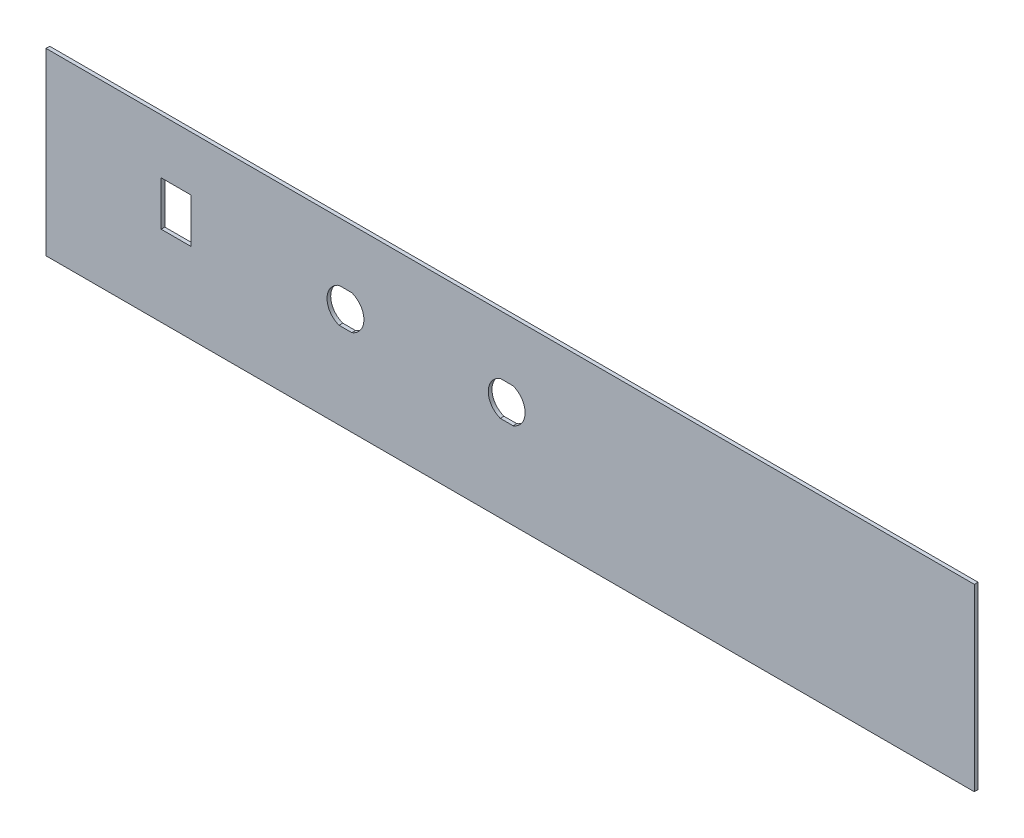
ISO-10303-21;
HEADER;
FILE_DESCRIPTION(('STEP AP214'),'2;1');
FILE_NAME('part.step','',(''),(''),'','','');
FILE_SCHEMA(('AUTOMOTIVE_DESIGN { 1 0 10303 214 1 1 1 1 }'));
ENDSEC;
DATA;
#1=APPLICATION_CONTEXT('core data for automotive mechanical design processes');
#2=APPLICATION_PROTOCOL_DEFINITION('international standard','automotive_design',2000,#1);
#3=PRODUCT_CONTEXT('',#1,'mechanical');
#4=PRODUCT('Part','Part','',(#3));
#5=PRODUCT_RELATED_PRODUCT_CATEGORY('part','',(#4));
#6=PRODUCT_DEFINITION_FORMATION('','',#4);
#7=PRODUCT_DEFINITION_CONTEXT('part definition',#1,'design');
#8=PRODUCT_DEFINITION('design','',#6,#7);
#9=PRODUCT_DEFINITION_SHAPE('','',#8);
#10=(LENGTH_UNIT() NAMED_UNIT(*) SI_UNIT(.MILLI.,.METRE.));
#11=(NAMED_UNIT(*) PLANE_ANGLE_UNIT() SI_UNIT($,.RADIAN.));
#12=(NAMED_UNIT(*) SI_UNIT($,.STERADIAN.) SOLID_ANGLE_UNIT());
#13=UNCERTAINTY_MEASURE_WITH_UNIT(LENGTH_MEASURE(1.E-05),#10,'distance_accuracy_value','');
#14=(GEOMETRIC_REPRESENTATION_CONTEXT(3) GLOBAL_UNCERTAINTY_ASSIGNED_CONTEXT((#13)) GLOBAL_UNIT_ASSIGNED_CONTEXT((#10,
#11,#12)) REPRESENTATION_CONTEXT('',''));
#15=CARTESIAN_POINT('',(0.,0.,0.));
#16=DIRECTION('',(0.,0.,1.));
#17=DIRECTION('',(1.,0.,0.));
#18=AXIS2_PLACEMENT_3D('',#15,#16,#17);
#19=CARTESIAN_POINT('',(0.,0.,1.6));
#20=DIRECTION('',(0.,0.,-1.));
#21=DIRECTION('',(-1.,0.,0.));
#22=AXIS2_PLACEMENT_3D('',#19,#20,#21);
#23=PLANE('',#22);
#24=DIRECTION('',(1.,0.,0.));
#25=VECTOR('',#24,1.);
#26=CARTESIAN_POINT('',(132.783736537781,37.4999459409795,1.6));
#27=LINE('',#26,#25);
#28=CARTESIAN_POINT('',(127.216263462219,37.4999459409795,1.6));
#29=VERTEX_POINT('',#28);
#30=CARTESIAN_POINT('',(132.783736537781,37.4999459409796,1.6));
#31=VERTEX_POINT('',#30);
#32=EDGE_CURVE('E157',#29,#31,#27,.T.);
#33=ORIENTED_EDGE('',*,*,#32,.F.);
#34=CARTESIAN_POINT('',(130.,45.,1.6));
#35=DIRECTION('',(0.,0.,1.));
#36=DIRECTION('',(1.,0.,0.));
#37=AXIS2_PLACEMENT_3D('',#34,#35,#36);
#38=CIRCLE('',#37,8.00000000000019);
#39=CARTESIAN_POINT('',(127.216263462219,52.5000540590203,1.6));
#40=VERTEX_POINT('',#39);
#41=EDGE_CURVE('E48',#40,#29,#38,.T.);
#42=ORIENTED_EDGE('',*,*,#41,.F.);
#43=DIRECTION('',(-1.,0.,0.));
#44=VECTOR('',#43,1.);
#45=CARTESIAN_POINT('',(127.216263462219,52.5000540590203,1.6));
#46=LINE('',#45,#44);
#47=CARTESIAN_POINT('',(132.783736537781,52.5000540590203,1.6));
#48=VERTEX_POINT('',#47);
#49=EDGE_CURVE('E163',#48,#40,#46,.T.);
#50=ORIENTED_EDGE('',*,*,#49,.F.);
#51=CARTESIAN_POINT('',(130.,45.,1.6));
#52=DIRECTION('',(0.,0.,1.));
#53=DIRECTION('',(1.,0.,0.));
#54=AXIS2_PLACEMENT_3D('',#51,#52,#53);
#55=CIRCLE('',#54,8.0000000000004);
#56=EDGE_CURVE('E148',#31,#48,#55,.T.);
#57=ORIENTED_EDGE('',*,*,#56,.F.);
#58=EDGE_LOOP('',(#33,#42,#50,#57));
#59=FACE_BOUND('',#58,.T.);
#60=DIRECTION('',(0.,-1.,0.));
#61=VECTOR('',#60,1.);
#62=CARTESIAN_POINT('',(0.,0.,1.6));
#63=LINE('',#62,#61);
#64=CARTESIAN_POINT('',(0.,78.,1.6));
#65=VERTEX_POINT('',#64);
#66=CARTESIAN_POINT('',(0.,0.,1.6));
#67=VERTEX_POINT('',#66);
#68=EDGE_CURVE('E223',#65,#67,#63,.T.);
#69=ORIENTED_EDGE('',*,*,#68,.T.);
#70=DIRECTION('',(1.,0.,0.));
#71=VECTOR('',#70,1.);
#72=CARTESIAN_POINT('',(0.,0.,1.6));
#73=LINE('',#72,#71);
#74=CARTESIAN_POINT('',(403.,0.,1.6));
#75=VERTEX_POINT('',#74);
#76=EDGE_CURVE('E226',#67,#75,#73,.T.);
#77=ORIENTED_EDGE('',*,*,#76,.T.);
#78=DIRECTION('',(0.,1.,0.));
#79=VECTOR('',#78,1.);
#80=CARTESIAN_POINT('',(403.,0.,1.6));
#81=LINE('',#80,#79);
#82=CARTESIAN_POINT('',(403.,78.,1.6));
#83=VERTEX_POINT('',#82);
#84=EDGE_CURVE('E229',#75,#83,#81,.T.);
#85=ORIENTED_EDGE('',*,*,#84,.T.);
#86=DIRECTION('',(-1.,0.,0.));
#87=VECTOR('',#86,1.);
#88=CARTESIAN_POINT('',(0.,78.,1.6));
#89=LINE('',#88,#87);
#90=EDGE_CURVE('E231',#83,#65,#89,.T.);
#91=ORIENTED_EDGE('',*,*,#90,.T.);
#92=EDGE_LOOP('',(#69,#77,#85,#91));
#93=FACE_BOUND('',#92,.T.);
#94=DIRECTION('',(1.,0.,0.));
#95=VECTOR('',#94,1.);
#96=CARTESIAN_POINT('',(50.,35.,1.6));
#97=LINE('',#96,#95);
#98=CARTESIAN_POINT('',(50.,35.,1.6));
#99=VERTEX_POINT('',#98);
#100=CARTESIAN_POINT('',(62.9,35.,1.6));
#101=VERTEX_POINT('',#100);
#102=EDGE_CURVE('E204',#99,#101,#97,.T.);
#103=ORIENTED_EDGE('',*,*,#102,.F.);
#104=DIRECTION('',(0.,-1.,0.));
#105=VECTOR('',#104,1.);
#106=CARTESIAN_POINT('',(50.,54.33,1.6));
#107=LINE('',#106,#105);
#108=CARTESIAN_POINT('',(50.,54.33,1.6));
#109=VERTEX_POINT('',#108);
#110=EDGE_CURVE('E202',#109,#99,#107,.T.);
#111=ORIENTED_EDGE('',*,*,#110,.F.);
#112=DIRECTION('',(-1.,0.,0.));
#113=VECTOR('',#112,1.);
#114=CARTESIAN_POINT('',(50.,54.33,1.6));
#115=LINE('',#114,#113);
#116=CARTESIAN_POINT('',(62.9,54.33,1.6));
#117=VERTEX_POINT('',#116);
#118=EDGE_CURVE('E210',#117,#109,#115,.T.);
#119=ORIENTED_EDGE('',*,*,#118,.F.);
#120=DIRECTION('',(0.,1.,0.));
#121=VECTOR('',#120,1.);
#122=CARTESIAN_POINT('',(62.9,54.33,1.6));
#123=LINE('',#122,#121);
#124=EDGE_CURVE('E207',#101,#117,#123,.T.);
#125=ORIENTED_EDGE('',*,*,#124,.F.);
#126=EDGE_LOOP('',(#103,#111,#119,#125));
#127=FACE_BOUND('',#126,.T.);
#128=CARTESIAN_POINT('',(200.,45.,1.6));
#129=DIRECTION('',(0.,0.,-1.));
#130=DIRECTION('',(-1.,0.,0.));
#131=AXIS2_PLACEMENT_3D('',#128,#129,#130);
#132=CIRCLE('',#131,8.00000000000008);
#133=CARTESIAN_POINT('',(197.21626346222,52.5000540590204,1.6));
#134=VERTEX_POINT('',#133);
#135=CARTESIAN_POINT('',(197.21626346222,37.4999459409796,1.6));
#136=VERTEX_POINT('',#135);
#137=EDGE_CURVE('E200',#134,#136,#132,.F.);
#138=ORIENTED_EDGE('',*,*,#137,.F.);
#139=DIRECTION('',(-1.,0.,0.));
#140=VECTOR('',#139,1.);
#141=CARTESIAN_POINT('',(0.,52.5000540590204,1.6));
#142=LINE('',#141,#140);
#143=CARTESIAN_POINT('',(202.78373653778,52.5000540590204,1.6));
#144=VERTEX_POINT('',#143);
#145=EDGE_CURVE('E193',#144,#134,#142,.T.);
#146=ORIENTED_EDGE('',*,*,#145,.F.);
#147=CARTESIAN_POINT('',(200.,45.,1.6));
#148=DIRECTION('',(0.,0.,-1.));
#149=DIRECTION('',(-1.,0.,0.));
#150=AXIS2_PLACEMENT_3D('',#147,#148,#149);
#151=CIRCLE('',#150,8.00000000000009);
#152=CARTESIAN_POINT('',(202.78373653778,37.4999459409796,1.6));
#153=VERTEX_POINT('',#152);
#154=EDGE_CURVE('E195',#153,#144,#151,.F.);
#155=ORIENTED_EDGE('',*,*,#154,.F.);
#156=DIRECTION('',(1.,0.,0.));
#157=VECTOR('',#156,1.);
#158=CARTESIAN_POINT('',(0.,37.4999459409796,1.6));
#159=LINE('',#158,#157);
#160=EDGE_CURVE('E198',#136,#153,#159,.T.);
#161=ORIENTED_EDGE('',*,*,#160,.F.);
#162=EDGE_LOOP('',(#138,#146,#155,#161));
#163=FACE_BOUND('',#162,.T.);
#164=ADVANCED_FACE('F33',(#59,#93,#127,#163),#23,.F.);
#165=CARTESIAN_POINT('',(0.,0.,0.));
#166=DIRECTION('',(0.,0.,-1.));
#167=DIRECTION('',(-1.,0.,0.));
#168=AXIS2_PLACEMENT_3D('',#165,#166,#167);
#169=PLANE('',#168);
#170=CARTESIAN_POINT('',(130.,45.,0.));
#171=DIRECTION('',(0.,0.,-1.));
#172=DIRECTION('',(-1.,0.,0.));
#173=AXIS2_PLACEMENT_3D('',#170,#171,#172);
#174=CIRCLE('',#173,8.00000000000019);
#175=CARTESIAN_POINT('',(127.216263462219,37.4999459409795,0.));
#176=VERTEX_POINT('',#175);
#177=CARTESIAN_POINT('',(127.216263462219,52.5000540590203,0.));
#178=VERTEX_POINT('',#177);
#179=EDGE_CURVE('E11',#176,#178,#174,.T.);
#180=ORIENTED_EDGE('',*,*,#179,.F.);
#181=DIRECTION('',(-1.,0.,0.));
#182=VECTOR('',#181,1.);
#183=CARTESIAN_POINT('',(0.,37.4999459409793,0.));
#184=LINE('',#183,#182);
#185=CARTESIAN_POINT('',(132.783736537781,37.4999459409795,0.));
#186=VERTEX_POINT('',#185);
#187=EDGE_CURVE('E261',#186,#176,#184,.T.);
#188=ORIENTED_EDGE('',*,*,#187,.F.);
#189=CARTESIAN_POINT('',(130.,45.,0.));
#190=DIRECTION('',(0.,0.,-1.));
#191=DIRECTION('',(-1.,0.,0.));
#192=AXIS2_PLACEMENT_3D('',#189,#190,#191);
#193=CIRCLE('',#192,8.0000000000004);
#194=CARTESIAN_POINT('',(132.783736537781,52.5000540590203,0.));
#195=VERTEX_POINT('',#194);
#196=EDGE_CURVE('E151',#195,#186,#193,.T.);
#197=ORIENTED_EDGE('',*,*,#196,.F.);
#198=DIRECTION('',(1.,0.,0.));
#199=VECTOR('',#198,1.);
#200=CARTESIAN_POINT('',(0.,52.5000540590204,0.));
#201=LINE('',#200,#199);
#202=EDGE_CURVE('E41',#178,#195,#201,.T.);
#203=ORIENTED_EDGE('',*,*,#202,.F.);
#204=EDGE_LOOP('',(#180,#188,#197,#203));
#205=FACE_BOUND('',#204,.T.);
#206=DIRECTION('',(0.,1.,0.));
#207=VECTOR('',#206,1.);
#208=CARTESIAN_POINT('',(50.,0.,0.));
#209=LINE('',#208,#207);
#210=CARTESIAN_POINT('',(50.,35.,0.));
#211=VERTEX_POINT('',#210);
#212=CARTESIAN_POINT('',(50.,54.33,0.));
#213=VERTEX_POINT('',#212);
#214=EDGE_CURVE('E259',#211,#213,#209,.T.);
#215=ORIENTED_EDGE('',*,*,#214,.F.);
#216=DIRECTION('',(-1.,0.,0.));
#217=VECTOR('',#216,1.);
#218=CARTESIAN_POINT('',(0.,35.,0.));
#219=LINE('',#218,#217);
#220=CARTESIAN_POINT('',(62.9,35.,0.));
#221=VERTEX_POINT('',#220);
#222=EDGE_CURVE('E252',#221,#211,#219,.T.);
#223=ORIENTED_EDGE('',*,*,#222,.F.);
#224=DIRECTION('',(0.,-1.,0.));
#225=VECTOR('',#224,1.);
#226=CARTESIAN_POINT('',(62.9,0.,0.));
#227=LINE('',#226,#225);
#228=CARTESIAN_POINT('',(62.9,54.33,0.));
#229=VERTEX_POINT('',#228);
#230=EDGE_CURVE('E254',#229,#221,#227,.T.);
#231=ORIENTED_EDGE('',*,*,#230,.F.);
#232=DIRECTION('',(1.,0.,0.));
#233=VECTOR('',#232,1.);
#234=CARTESIAN_POINT('',(0.,54.33,0.));
#235=LINE('',#234,#233);
#236=EDGE_CURVE('E257',#213,#229,#235,.T.);
#237=ORIENTED_EDGE('',*,*,#236,.F.);
#238=EDGE_LOOP('',(#215,#223,#231,#237));
#239=FACE_BOUND('',#238,.T.);
#240=DIRECTION('',(0.,-1.,0.));
#241=VECTOR('',#240,1.);
#242=CARTESIAN_POINT('',(0.,0.,0.));
#243=LINE('',#242,#241);
#244=CARTESIAN_POINT('',(0.,78.,0.));
#245=VERTEX_POINT('',#244);
#246=CARTESIAN_POINT('',(0.,0.,0.));
#247=VERTEX_POINT('',#246);
#248=EDGE_CURVE('E216',#245,#247,#243,.T.);
#249=ORIENTED_EDGE('',*,*,#248,.F.);
#250=DIRECTION('',(-1.,0.,0.));
#251=VECTOR('',#250,1.);
#252=CARTESIAN_POINT('',(0.,78.,0.));
#253=LINE('',#252,#251);
#254=CARTESIAN_POINT('',(403.,78.,0.));
#255=VERTEX_POINT('',#254);
#256=EDGE_CURVE('E227',#255,#245,#253,.T.);
#257=ORIENTED_EDGE('',*,*,#256,.F.);
#258=DIRECTION('',(0.,1.,0.));
#259=VECTOR('',#258,1.);
#260=CARTESIAN_POINT('',(403.,0.,0.));
#261=LINE('',#260,#259);
#262=CARTESIAN_POINT('',(403.,0.,0.));
#263=VERTEX_POINT('',#262);
#264=EDGE_CURVE('E238',#263,#255,#261,.T.);
#265=ORIENTED_EDGE('',*,*,#264,.F.);
#266=DIRECTION('',(1.,0.,0.));
#267=VECTOR('',#266,1.);
#268=CARTESIAN_POINT('',(0.,0.,0.));
#269=LINE('',#268,#267);
#270=EDGE_CURVE('E236',#247,#263,#269,.T.);
#271=ORIENTED_EDGE('',*,*,#270,.F.);
#272=EDGE_LOOP('',(#249,#257,#265,#271));
#273=FACE_BOUND('',#272,.T.);
#274=DIRECTION('',(-1.,0.,0.));
#275=VECTOR('',#274,1.);
#276=CARTESIAN_POINT('',(197.21626346222,52.5000540590204,0.));
#277=LINE('',#276,#275);
#278=CARTESIAN_POINT('',(202.78373653778,52.5000540590204,0.));
#279=VERTEX_POINT('',#278);
#280=CARTESIAN_POINT('',(197.21626346222,52.5000540590204,0.));
#281=VERTEX_POINT('',#280);
#282=EDGE_CURVE('E181',#279,#281,#277,.T.);
#283=ORIENTED_EDGE('',*,*,#282,.T.);
#284=CARTESIAN_POINT('',(200.,45.,0.));
#285=DIRECTION('',(0.,0.,1.));
#286=DIRECTION('',(1.,0.,0.));
#287=AXIS2_PLACEMENT_3D('',#284,#285,#286);
#288=CIRCLE('',#287,8.00000000000008);
#289=CARTESIAN_POINT('',(197.21626346222,37.4999459409796,0.));
#290=VERTEX_POINT('',#289);
#291=EDGE_CURVE('E170',#281,#290,#288,.T.);
#292=ORIENTED_EDGE('',*,*,#291,.T.);
#293=DIRECTION('',(1.,0.,0.));
#294=VECTOR('',#293,1.);
#295=CARTESIAN_POINT('',(202.78373653778,37.4999459409796,0.));
#296=LINE('',#295,#294);
#297=CARTESIAN_POINT('',(202.78373653778,37.4999459409796,0.));
#298=VERTEX_POINT('',#297);
#299=EDGE_CURVE('E175',#290,#298,#296,.T.);
#300=ORIENTED_EDGE('',*,*,#299,.T.);
#301=CARTESIAN_POINT('',(200.,45.,0.));
#302=DIRECTION('',(0.,0.,1.));
#303=DIRECTION('',(1.,0.,0.));
#304=AXIS2_PLACEMENT_3D('',#301,#302,#303);
#305=CIRCLE('',#304,8.00000000000009);
#306=EDGE_CURVE('E178',#298,#279,#305,.T.);
#307=ORIENTED_EDGE('',*,*,#306,.T.);
#308=EDGE_LOOP('',(#283,#292,#300,#307));
#309=FACE_BOUND('',#308,.T.);
#310=ADVANCED_FACE('F269',(#205,#239,#273,#309),#169,.T.);
#311=CARTESIAN_POINT('',(0.,0.,1.6));
#312=DIRECTION('',(1.,0.,0.));
#313=DIRECTION('',(0.,0.,-1.));
#314=AXIS2_PLACEMENT_3D('',#311,#312,#313);
#315=PLANE('',#314);
#316=ORIENTED_EDGE('',*,*,#248,.T.);
#317=DIRECTION('',(0.,0.,-1.));
#318=VECTOR('',#317,1.);
#319=CARTESIAN_POINT('',(0.,0.,1.6));
#320=LINE('',#319,#318);
#321=EDGE_CURVE('E249',#67,#247,#320,.T.);
#322=ORIENTED_EDGE('',*,*,#321,.F.);
#323=ORIENTED_EDGE('',*,*,#68,.F.);
#324=DIRECTION('',(0.,0.,-1.));
#325=VECTOR('',#324,1.);
#326=CARTESIAN_POINT('',(0.,78.,1.6));
#327=LINE('',#326,#325);
#328=EDGE_CURVE('E233',#65,#245,#327,.T.);
#329=ORIENTED_EDGE('',*,*,#328,.T.);
#330=EDGE_LOOP('',(#316,#322,#323,#329));
#331=FACE_BOUND('',#330,.T.);
#332=ADVANCED_FACE('F35',(#331),#315,.F.);
#333=CARTESIAN_POINT('',(0.,0.,1.6));
#334=DIRECTION('',(0.,1.,0.));
#335=DIRECTION('',(0.,0.,1.));
#336=AXIS2_PLACEMENT_3D('',#333,#334,#335);
#337=PLANE('',#336);
#338=ORIENTED_EDGE('',*,*,#270,.T.);
#339=DIRECTION('',(0.,0.,-1.));
#340=VECTOR('',#339,1.);
#341=CARTESIAN_POINT('',(403.,0.,1.6));
#342=LINE('',#341,#340);
#343=EDGE_CURVE('E246',#75,#263,#342,.T.);
#344=ORIENTED_EDGE('',*,*,#343,.F.);
#345=ORIENTED_EDGE('',*,*,#76,.F.);
#346=ORIENTED_EDGE('',*,*,#321,.T.);
#347=EDGE_LOOP('',(#338,#344,#345,#346));
#348=FACE_BOUND('',#347,.T.);
#349=ADVANCED_FACE('F300',(#348),#337,.F.);
#350=CARTESIAN_POINT('',(403.,0.,1.6));
#351=DIRECTION('',(-1.,0.,0.));
#352=DIRECTION('',(0.,0.,1.));
#353=AXIS2_PLACEMENT_3D('',#350,#351,#352);
#354=PLANE('',#353);
#355=ORIENTED_EDGE('',*,*,#264,.T.);
#356=DIRECTION('',(0.,0.,-1.));
#357=VECTOR('',#356,1.);
#358=CARTESIAN_POINT('',(403.,78.,1.6));
#359=LINE('',#358,#357);
#360=EDGE_CURVE('E243',#83,#255,#359,.T.);
#361=ORIENTED_EDGE('',*,*,#360,.F.);
#362=ORIENTED_EDGE('',*,*,#84,.F.);
#363=ORIENTED_EDGE('',*,*,#343,.T.);
#364=EDGE_LOOP('',(#355,#361,#362,#363));
#365=FACE_BOUND('',#364,.T.);
#366=ADVANCED_FACE('F297',(#365),#354,.F.);
#367=CARTESIAN_POINT('',(0.,78.,1.6));
#368=DIRECTION('',(0.,-1.,0.));
#369=DIRECTION('',(0.,0.,-1.));
#370=AXIS2_PLACEMENT_3D('',#367,#368,#369);
#371=PLANE('',#370);
#372=ORIENTED_EDGE('',*,*,#256,.T.);
#373=ORIENTED_EDGE('',*,*,#328,.F.);
#374=ORIENTED_EDGE('',*,*,#90,.F.);
#375=ORIENTED_EDGE('',*,*,#360,.T.);
#376=EDGE_LOOP('',(#372,#373,#374,#375));
#377=FACE_BOUND('',#376,.T.);
#378=ADVANCED_FACE('F294',(#377),#371,.F.);
#379=CARTESIAN_POINT('',(50.,54.33,-8.4));
#380=DIRECTION('',(-1.,0.,0.));
#381=DIRECTION('',(0.,0.,1.));
#382=AXIS2_PLACEMENT_3D('',#379,#380,#381);
#383=PLANE('',#382);
#384=ORIENTED_EDGE('',*,*,#214,.T.);
#385=DIRECTION('',(0.,0.,1.));
#386=VECTOR('',#385,1.);
#387=CARTESIAN_POINT('',(50.,54.33,-8.4));
#388=LINE('',#387,#386);
#389=EDGE_CURVE('E214',#213,#109,#388,.T.);
#390=ORIENTED_EDGE('',*,*,#389,.T.);
#391=ORIENTED_EDGE('',*,*,#110,.T.);
#392=DIRECTION('',(0.,0.,1.));
#393=VECTOR('',#392,1.);
#394=CARTESIAN_POINT('',(50.,35.,-8.4));
#395=LINE('',#394,#393);
#396=EDGE_CURVE('E213',#211,#99,#395,.T.);
#397=ORIENTED_EDGE('',*,*,#396,.F.);
#398=EDGE_LOOP('',(#384,#390,#391,#397));
#399=FACE_BOUND('',#398,.T.);
#400=ADVANCED_FACE('F291',(#399),#383,.F.);
#401=CARTESIAN_POINT('',(50.,54.33,-8.4));
#402=DIRECTION('',(0.,1.,0.));
#403=DIRECTION('',(0.,0.,1.));
#404=AXIS2_PLACEMENT_3D('',#401,#402,#403);
#405=PLANE('',#404);
#406=ORIENTED_EDGE('',*,*,#236,.T.);
#407=DIRECTION('',(0.,0.,1.));
#408=VECTOR('',#407,1.);
#409=CARTESIAN_POINT('',(62.9,54.33,-8.4));
#410=LINE('',#409,#408);
#411=EDGE_CURVE('E217',#229,#117,#410,.T.);
#412=ORIENTED_EDGE('',*,*,#411,.T.);
#413=ORIENTED_EDGE('',*,*,#118,.T.);
#414=ORIENTED_EDGE('',*,*,#389,.F.);
#415=EDGE_LOOP('',(#406,#412,#413,#414));
#416=FACE_BOUND('',#415,.T.);
#417=ADVANCED_FACE('F350',(#416),#405,.F.);
#418=CARTESIAN_POINT('',(62.9,54.33,-8.4));
#419=DIRECTION('',(1.,0.,0.));
#420=DIRECTION('',(0.,0.,-1.));
#421=AXIS2_PLACEMENT_3D('',#418,#419,#420);
#422=PLANE('',#421);
#423=ORIENTED_EDGE('',*,*,#230,.T.);
#424=DIRECTION('',(0.,0.,1.));
#425=VECTOR('',#424,1.);
#426=CARTESIAN_POINT('',(62.9,35.,-8.4));
#427=LINE('',#426,#425);
#428=EDGE_CURVE('E219',#221,#101,#427,.T.);
#429=ORIENTED_EDGE('',*,*,#428,.T.);
#430=ORIENTED_EDGE('',*,*,#124,.T.);
#431=ORIENTED_EDGE('',*,*,#411,.F.);
#432=EDGE_LOOP('',(#423,#429,#430,#431));
#433=FACE_BOUND('',#432,.T.);
#434=ADVANCED_FACE('F353',(#433),#422,.F.);
#435=CARTESIAN_POINT('',(50.,35.,-8.4));
#436=DIRECTION('',(0.,-1.,0.));
#437=DIRECTION('',(0.,0.,-1.));
#438=AXIS2_PLACEMENT_3D('',#435,#436,#437);
#439=PLANE('',#438);
#440=ORIENTED_EDGE('',*,*,#222,.T.);
#441=ORIENTED_EDGE('',*,*,#396,.T.);
#442=ORIENTED_EDGE('',*,*,#102,.T.);
#443=ORIENTED_EDGE('',*,*,#428,.F.);
#444=EDGE_LOOP('',(#440,#441,#442,#443));
#445=FACE_BOUND('',#444,.T.);
#446=ADVANCED_FACE('F349',(#445),#439,.F.);
#447=CARTESIAN_POINT('',(200.,45.,10.));
#448=DIRECTION('',(0.,0.,-1.));
#449=DIRECTION('',(-1.,0.,0.));
#450=AXIS2_PLACEMENT_3D('',#447,#448,#449);
#451=CYLINDRICAL_SURFACE('',#450,8.00000000000008);
#452=ORIENTED_EDGE('',*,*,#137,.T.);
#453=DIRECTION('',(0.,0.,-1.));
#454=VECTOR('',#453,1.);
#455=CARTESIAN_POINT('',(197.21626346222,37.4999459409796,10.));
#456=LINE('',#455,#454);
#457=EDGE_CURVE('E191',#136,#290,#456,.T.);
#458=ORIENTED_EDGE('',*,*,#457,.T.);
#459=ORIENTED_EDGE('',*,*,#291,.F.);
#460=DIRECTION('',(0.,0.,-1.));
#461=VECTOR('',#460,1.);
#462=CARTESIAN_POINT('',(197.21626346222,52.5000540590204,10.));
#463=LINE('',#462,#461);
#464=EDGE_CURVE('E184',#134,#281,#463,.T.);
#465=ORIENTED_EDGE('',*,*,#464,.F.);
#466=EDGE_LOOP('',(#452,#458,#459,#465));
#467=FACE_BOUND('',#466,.T.);
#468=ADVANCED_FACE('F332',(#467),#451,.F.);
#469=CARTESIAN_POINT('',(202.78373653778,37.4999459409796,10.));
#470=DIRECTION('',(0.,1.,0.));
#471=DIRECTION('',(0.,0.,1.));
#472=AXIS2_PLACEMENT_3D('',#469,#470,#471);
#473=PLANE('',#472);
#474=ORIENTED_EDGE('',*,*,#160,.T.);
#475=DIRECTION('',(0.,0.,-1.));
#476=VECTOR('',#475,1.);
#477=CARTESIAN_POINT('',(202.78373653778,37.4999459409796,10.));
#478=LINE('',#477,#476);
#479=EDGE_CURVE('E189',#153,#298,#478,.T.);
#480=ORIENTED_EDGE('',*,*,#479,.T.);
#481=ORIENTED_EDGE('',*,*,#299,.F.);
#482=ORIENTED_EDGE('',*,*,#457,.F.);
#483=EDGE_LOOP('',(#474,#480,#481,#482));
#484=FACE_BOUND('',#483,.T.);
#485=ADVANCED_FACE('F335',(#484),#473,.T.);
#486=CARTESIAN_POINT('',(200.,45.,10.));
#487=DIRECTION('',(0.,0.,-1.));
#488=DIRECTION('',(-1.,0.,0.));
#489=AXIS2_PLACEMENT_3D('',#486,#487,#488);
#490=CYLINDRICAL_SURFACE('',#489,8.00000000000009);
#491=ORIENTED_EDGE('',*,*,#154,.T.);
#492=DIRECTION('',(0.,0.,-1.));
#493=VECTOR('',#492,1.);
#494=CARTESIAN_POINT('',(202.78373653778,52.5000540590204,10.));
#495=LINE('',#494,#493);
#496=EDGE_CURVE('E187',#144,#279,#495,.T.);
#497=ORIENTED_EDGE('',*,*,#496,.T.);
#498=ORIENTED_EDGE('',*,*,#306,.F.);
#499=ORIENTED_EDGE('',*,*,#479,.F.);
#500=EDGE_LOOP('',(#491,#497,#498,#499));
#501=FACE_BOUND('',#500,.T.);
#502=ADVANCED_FACE('F280',(#501),#490,.F.);
#503=CARTESIAN_POINT('',(197.21626346222,52.5000540590204,10.));
#504=DIRECTION('',(0.,-1.,0.));
#505=DIRECTION('',(0.,0.,-1.));
#506=AXIS2_PLACEMENT_3D('',#503,#504,#505);
#507=PLANE('',#506);
#508=ORIENTED_EDGE('',*,*,#145,.T.);
#509=ORIENTED_EDGE('',*,*,#464,.T.);
#510=ORIENTED_EDGE('',*,*,#282,.F.);
#511=ORIENTED_EDGE('',*,*,#496,.F.);
#512=EDGE_LOOP('',(#508,#509,#510,#511));
#513=FACE_BOUND('',#512,.T.);
#514=ADVANCED_FACE('F273',(#513),#507,.T.);
#515=CARTESIAN_POINT('',(130.,45.,-8.4));
#516=DIRECTION('',(0.,0.,1.));
#517=DIRECTION('',(1.,0.,0.));
#518=AXIS2_PLACEMENT_3D('',#515,#516,#517);
#519=CYLINDRICAL_SURFACE('',#518,8.00000000000019);
#520=ORIENTED_EDGE('',*,*,#179,.T.);
#521=DIRECTION('',(0.,0.,1.));
#522=VECTOR('',#521,1.);
#523=CARTESIAN_POINT('',(127.216263462219,52.5000540590203,-8.4));
#524=LINE('',#523,#522);
#525=EDGE_CURVE('E168',#178,#40,#524,.T.);
#526=ORIENTED_EDGE('',*,*,#525,.T.);
#527=ORIENTED_EDGE('',*,*,#41,.T.);
#528=DIRECTION('',(0.,0.,1.));
#529=VECTOR('',#528,1.);
#530=CARTESIAN_POINT('',(127.216263462219,37.4999459409795,-8.4));
#531=LINE('',#530,#529);
#532=EDGE_CURVE('E154',#176,#29,#531,.T.);
#533=ORIENTED_EDGE('',*,*,#532,.F.);
#534=EDGE_LOOP('',(#520,#526,#527,#533));
#535=FACE_BOUND('',#534,.T.);
#536=ADVANCED_FACE('F271',(#535),#519,.F.);
#537=CARTESIAN_POINT('',(127.216263462219,52.5000540590203,-8.4));
#538=DIRECTION('',(0.,1.,0.));
#539=DIRECTION('',(-1.,0.,0.));
#540=AXIS2_PLACEMENT_3D('',#537,#538,#539);
#541=PLANE('',#540);
#542=ORIENTED_EDGE('',*,*,#202,.T.);
#543=DIRECTION('',(0.,0.,1.));
#544=VECTOR('',#543,1.);
#545=CARTESIAN_POINT('',(132.783736537781,52.5000540590203,-8.4));
#546=LINE('',#545,#544);
#547=EDGE_CURVE('E153',#195,#48,#546,.T.);
#548=ORIENTED_EDGE('',*,*,#547,.T.);
#549=ORIENTED_EDGE('',*,*,#49,.T.);
#550=ORIENTED_EDGE('',*,*,#525,.F.);
#551=EDGE_LOOP('',(#542,#548,#549,#550));
#552=FACE_BOUND('',#551,.T.);
#553=ADVANCED_FACE('F266',(#552),#541,.F.);
#554=CARTESIAN_POINT('',(130.,45.,-8.4));
#555=DIRECTION('',(0.,0.,1.));
#556=DIRECTION('',(1.,0.,0.));
#557=AXIS2_PLACEMENT_3D('',#554,#555,#556);
#558=CYLINDRICAL_SURFACE('',#557,8.0000000000004);
#559=ORIENTED_EDGE('',*,*,#196,.T.);
#560=DIRECTION('',(0.,0.,1.));
#561=VECTOR('',#560,1.);
#562=CARTESIAN_POINT('',(132.783736537781,37.4999459409796,-8.4));
#563=LINE('',#562,#561);
#564=EDGE_CURVE('E56',#186,#31,#563,.T.);
#565=ORIENTED_EDGE('',*,*,#564,.T.);
#566=ORIENTED_EDGE('',*,*,#56,.T.);
#567=ORIENTED_EDGE('',*,*,#547,.F.);
#568=EDGE_LOOP('',(#559,#565,#566,#567));
#569=FACE_BOUND('',#568,.T.);
#570=ADVANCED_FACE('F145',(#569),#558,.F.);
#571=CARTESIAN_POINT('',(132.783736537781,37.4999459409795,-8.4));
#572=DIRECTION('',(0.,-1.,0.));
#573=DIRECTION('',(1.,0.,0.));
#574=AXIS2_PLACEMENT_3D('',#571,#572,#573);
#575=PLANE('',#574);
#576=ORIENTED_EDGE('',*,*,#187,.T.);
#577=ORIENTED_EDGE('',*,*,#532,.T.);
#578=ORIENTED_EDGE('',*,*,#32,.T.);
#579=ORIENTED_EDGE('',*,*,#564,.F.);
#580=EDGE_LOOP('',(#576,#577,#578,#579));
#581=FACE_BOUND('',#580,.T.);
#582=ADVANCED_FACE('F158',(#581),#575,.F.);
#583=CLOSED_SHELL('',(#164,#310,#332,#349,#366,#378,#400,#417,#434,#446,#468,#485,#502,#514,
#536,#553,#570,#582));
#584=MANIFOLD_SOLID_BREP('B2',#583);
#585=ADVANCED_BREP_SHAPE_REPRESENTATION('',(#18,#584),#14);
#586=SHAPE_DEFINITION_REPRESENTATION(#9,#585);
ENDSEC;
END-ISO-10303-21;
